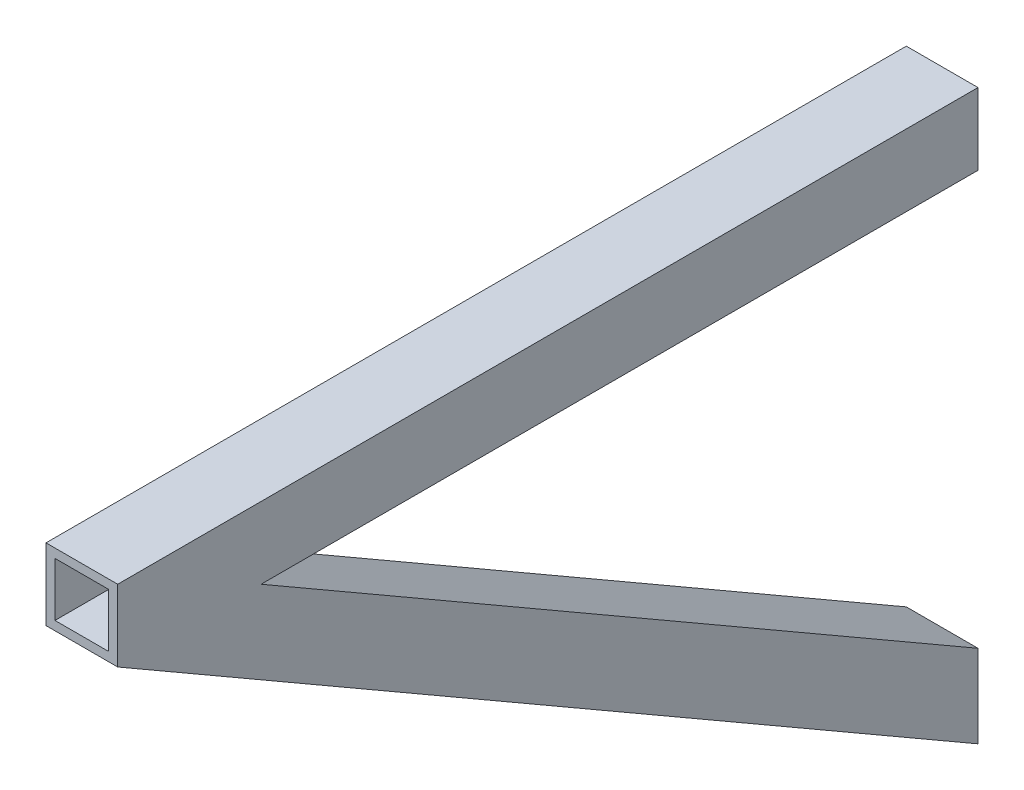
ISO-10303-21;
HEADER;
FILE_DESCRIPTION(('STEP AP214'),'2;1');
FILE_NAME('part.step','',(''),(''),'','','');
FILE_SCHEMA(('AUTOMOTIVE_DESIGN { 1 0 10303 214 1 1 1 1 }'));
ENDSEC;
DATA;
#1=APPLICATION_CONTEXT('core data for automotive mechanical design processes');
#2=APPLICATION_PROTOCOL_DEFINITION('international standard','automotive_design',2000,#1);
#3=PRODUCT_CONTEXT('',#1,'mechanical');
#4=PRODUCT('Part','Part','',(#3));
#5=PRODUCT_RELATED_PRODUCT_CATEGORY('part','',(#4));
#6=PRODUCT_DEFINITION_FORMATION('','',#4);
#7=PRODUCT_DEFINITION_CONTEXT('part definition',#1,'design');
#8=PRODUCT_DEFINITION('design','',#6,#7);
#9=PRODUCT_DEFINITION_SHAPE('','',#8);
#10=(LENGTH_UNIT() NAMED_UNIT(*) SI_UNIT(.MILLI.,.METRE.));
#11=(NAMED_UNIT(*) PLANE_ANGLE_UNIT() SI_UNIT($,.RADIAN.));
#12=(NAMED_UNIT(*) SI_UNIT($,.STERADIAN.) SOLID_ANGLE_UNIT());
#13=UNCERTAINTY_MEASURE_WITH_UNIT(LENGTH_MEASURE(1.E-05),#10,'distance_accuracy_value','');
#14=(GEOMETRIC_REPRESENTATION_CONTEXT(3) GLOBAL_UNCERTAINTY_ASSIGNED_CONTEXT((#13)) GLOBAL_UNIT_ASSIGNED_CONTEXT((#10,
#11,#12)) REPRESENTATION_CONTEXT('',''));
#15=CARTESIAN_POINT('',(0.,0.,0.));
#16=DIRECTION('',(0.,0.,1.));
#17=DIRECTION('',(1.,0.,0.));
#18=AXIS2_PLACEMENT_3D('',#15,#16,#17);
#19=CARTESIAN_POINT('',(0.,0.,304.8));
#20=DIRECTION('',(0.,1.,0.));
#21=DIRECTION('',(0.,0.,1.));
#22=AXIS2_PLACEMENT_3D('',#19,#20,#21);
#23=PLANE('',#22);
#24=DIRECTION('',(1.,0.,0.));
#25=VECTOR('',#24,1.);
#26=CARTESIAN_POINT('',(25.4,0.,254.));
#27=LINE('',#26,#25);
#28=CARTESIAN_POINT('',(0.,0.,254.));
#29=VERTEX_POINT('',#28);
#30=CARTESIAN_POINT('',(25.4,0.,254.));
#31=VERTEX_POINT('',#30);
#32=EDGE_CURVE('E176',#29,#31,#27,.T.);
#33=ORIENTED_EDGE('',*,*,#32,.F.);
#34=DIRECTION('',(0.,0.,-1.));
#35=VECTOR('',#34,1.);
#36=CARTESIAN_POINT('',(0.,0.,304.8));
#37=LINE('',#36,#35);
#38=CARTESIAN_POINT('',(0.,0.,0.));
#39=VERTEX_POINT('',#38);
#40=EDGE_CURVE('E51',#29,#39,#37,.T.);
#41=ORIENTED_EDGE('',*,*,#40,.T.);
#42=DIRECTION('',(1.,0.,0.));
#43=VECTOR('',#42,1.);
#44=CARTESIAN_POINT('',(0.,0.,0.));
#45=LINE('',#44,#43);
#46=CARTESIAN_POINT('',(25.4,0.,0.));
#47=VERTEX_POINT('',#46);
#48=EDGE_CURVE('E264',#39,#47,#45,.T.);
#49=ORIENTED_EDGE('',*,*,#48,.T.);
#50=DIRECTION('',(0.,0.,-1.));
#51=VECTOR('',#50,1.);
#52=CARTESIAN_POINT('',(25.4,0.,304.8));
#53=LINE('',#52,#51);
#54=EDGE_CURVE('E279',#31,#47,#53,.T.);
#55=ORIENTED_EDGE('',*,*,#54,.F.);
#56=EDGE_LOOP('',(#33,#41,#49,#55));
#57=FACE_BOUND('',#56,.T.);
#58=ADVANCED_FACE('F41',(#57),#23,.F.);
#59=CARTESIAN_POINT('',(0.,0.,304.8));
#60=DIRECTION('',(0.,0.,-1.));
#61=DIRECTION('',(-1.,0.,0.));
#62=AXIS2_PLACEMENT_3D('',#59,#60,#61);
#63=PLANE('',#62);
#64=DIRECTION('',(0.,-1.,0.));
#65=VECTOR('',#64,1.);
#66=CARTESIAN_POINT('',(0.,0.,304.8));
#67=LINE('',#66,#65);
#68=CARTESIAN_POINT('',(0.,25.4,304.8));
#69=VERTEX_POINT('',#68);
#70=CARTESIAN_POINT('',(0.,0.,304.8));
#71=VERTEX_POINT('',#70);
#72=EDGE_CURVE('E248',#69,#71,#67,.T.);
#73=ORIENTED_EDGE('',*,*,#72,.T.);
#74=DIRECTION('',(1.,0.,0.));
#75=VECTOR('',#74,1.);
#76=CARTESIAN_POINT('',(0.,0.,304.8));
#77=LINE('',#76,#75);
#78=CARTESIAN_POINT('',(25.4,0.,304.8));
#79=VERTEX_POINT('',#78);
#80=EDGE_CURVE('E189',#71,#79,#77,.T.);
#81=ORIENTED_EDGE('',*,*,#80,.T.);
#82=DIRECTION('',(0.,1.,0.));
#83=VECTOR('',#82,1.);
#84=CARTESIAN_POINT('',(25.4,0.,304.8));
#85=LINE('',#84,#83);
#86=CARTESIAN_POINT('',(25.4,25.4,304.8));
#87=VERTEX_POINT('',#86);
#88=EDGE_CURVE('E254',#79,#87,#85,.T.);
#89=ORIENTED_EDGE('',*,*,#88,.T.);
#90=DIRECTION('',(-1.,0.,0.));
#91=VECTOR('',#90,1.);
#92=CARTESIAN_POINT('',(0.,25.4,304.8));
#93=LINE('',#92,#91);
#94=EDGE_CURVE('E257',#87,#69,#93,.T.);
#95=ORIENTED_EDGE('',*,*,#94,.T.);
#96=EDGE_LOOP('',(#73,#81,#89,#95));
#97=FACE_BOUND('',#96,.T.);
#98=DIRECTION('',(0.,-1.,0.));
#99=VECTOR('',#98,1.);
#100=CARTESIAN_POINT('',(3.175,22.225,304.8));
#101=LINE('',#100,#99);
#102=CARTESIAN_POINT('',(3.175,22.225,304.8));
#103=VERTEX_POINT('',#102);
#104=CARTESIAN_POINT('',(3.175,3.175,304.8));
#105=VERTEX_POINT('',#104);
#106=EDGE_CURVE('E204',#103,#105,#101,.T.);
#107=ORIENTED_EDGE('',*,*,#106,.F.);
#108=DIRECTION('',(-1.,0.,0.));
#109=VECTOR('',#108,1.);
#110=CARTESIAN_POINT('',(3.175,22.225,304.8));
#111=LINE('',#110,#109);
#112=CARTESIAN_POINT('',(22.225,22.225,304.8));
#113=VERTEX_POINT('',#112);
#114=EDGE_CURVE('E215',#113,#103,#111,.T.);
#115=ORIENTED_EDGE('',*,*,#114,.F.);
#116=DIRECTION('',(0.,1.,0.));
#117=VECTOR('',#116,1.);
#118=CARTESIAN_POINT('',(22.225,22.225,304.8));
#119=LINE('',#118,#117);
#120=CARTESIAN_POINT('',(22.225,3.175,304.8));
#121=VERTEX_POINT('',#120);
#122=EDGE_CURVE('E211',#121,#113,#119,.T.);
#123=ORIENTED_EDGE('',*,*,#122,.F.);
#124=DIRECTION('',(1.,0.,0.));
#125=VECTOR('',#124,1.);
#126=CARTESIAN_POINT('',(3.175,3.175,304.8));
#127=LINE('',#126,#125);
#128=EDGE_CURVE('E207',#105,#121,#127,.T.);
#129=ORIENTED_EDGE('',*,*,#128,.F.);
#130=EDGE_LOOP('',(#107,#115,#123,#129));
#131=FACE_BOUND('',#130,.T.);
#132=ADVANCED_FACE('F371',(#97,#131),#63,.F.);
#133=CARTESIAN_POINT('',(0.,0.,0.));
#134=DIRECTION('',(0.,0.,-1.));
#135=DIRECTION('',(-1.,0.,0.));
#136=AXIS2_PLACEMENT_3D('',#133,#134,#135);
#137=PLANE('',#136);
#138=DIRECTION('',(0.,-1.,0.));
#139=VECTOR('',#138,1.);
#140=CARTESIAN_POINT('',(0.,0.,0.));
#141=LINE('',#140,#139);
#142=CARTESIAN_POINT('',(0.,25.4,0.));
#143=VERTEX_POINT('',#142);
#144=EDGE_CURVE('E247',#143,#39,#141,.T.);
#145=ORIENTED_EDGE('',*,*,#144,.F.);
#146=DIRECTION('',(-1.,0.,0.));
#147=VECTOR('',#146,1.);
#148=CARTESIAN_POINT('',(0.,25.4,0.));
#149=LINE('',#148,#147);
#150=CARTESIAN_POINT('',(25.4,25.4,0.));
#151=VERTEX_POINT('',#150);
#152=EDGE_CURVE('E251',#151,#143,#149,.T.);
#153=ORIENTED_EDGE('',*,*,#152,.F.);
#154=DIRECTION('',(0.,1.,0.));
#155=VECTOR('',#154,1.);
#156=CARTESIAN_POINT('',(25.4,0.,0.));
#157=LINE('',#156,#155);
#158=EDGE_CURVE('E268',#47,#151,#157,.T.);
#159=ORIENTED_EDGE('',*,*,#158,.F.);
#160=ORIENTED_EDGE('',*,*,#48,.F.);
#161=EDGE_LOOP('',(#145,#153,#159,#160));
#162=FACE_BOUND('',#161,.T.);
#163=DIRECTION('',(-1.,0.,0.));
#164=VECTOR('',#163,1.);
#165=CARTESIAN_POINT('',(3.175,22.225,0.));
#166=LINE('',#165,#164);
#167=CARTESIAN_POINT('',(22.225,22.225,0.));
#168=VERTEX_POINT('',#167);
#169=CARTESIAN_POINT('',(3.175,22.225,0.));
#170=VERTEX_POINT('',#169);
#171=EDGE_CURVE('E208',#168,#170,#166,.T.);
#172=ORIENTED_EDGE('',*,*,#171,.T.);
#173=DIRECTION('',(0.,-1.,0.));
#174=VECTOR('',#173,1.);
#175=CARTESIAN_POINT('',(3.175,22.225,0.));
#176=LINE('',#175,#174);
#177=CARTESIAN_POINT('',(3.175,3.175,0.));
#178=VERTEX_POINT('',#177);
#179=EDGE_CURVE('E219',#170,#178,#176,.T.);
#180=ORIENTED_EDGE('',*,*,#179,.T.);
#181=DIRECTION('',(1.,0.,0.));
#182=VECTOR('',#181,1.);
#183=CARTESIAN_POINT('',(3.175,3.175,0.));
#184=LINE('',#183,#182);
#185=CARTESIAN_POINT('',(22.225,3.175,0.));
#186=VERTEX_POINT('',#185);
#187=EDGE_CURVE('E223',#178,#186,#184,.T.);
#188=ORIENTED_EDGE('',*,*,#187,.T.);
#189=DIRECTION('',(0.,1.,0.));
#190=VECTOR('',#189,1.);
#191=CARTESIAN_POINT('',(22.225,22.225,0.));
#192=LINE('',#191,#190);
#193=EDGE_CURVE('E227',#186,#168,#192,.T.);
#194=ORIENTED_EDGE('',*,*,#193,.T.);
#195=EDGE_LOOP('',(#172,#180,#188,#194));
#196=FACE_BOUND('',#195,.T.);
#197=ADVANCED_FACE('F363',(#162,#196),#137,.T.);
#198=CARTESIAN_POINT('',(0.,0.,304.8));
#199=DIRECTION('',(1.,0.,0.));
#200=DIRECTION('',(0.,1.,0.));
#201=AXIS2_PLACEMENT_3D('',#198,#199,#200);
#202=PLANE('',#201);
#203=DIRECTION('',(0.,0.500000000000001,0.866025403784438));
#204=VECTOR('',#203,1.);
#205=CARTESIAN_POINT('',(0.,-190.5,-75.9556788418709));
#206=LINE('',#205,#204);
#207=CARTESIAN_POINT('',(0.,-146.646968374165,0.));
#208=VERTEX_POINT('',#207);
#209=EDGE_CURVE('E45',#208,#29,#206,.T.);
#210=ORIENTED_EDGE('',*,*,#209,.F.);
#211=DIRECTION('',(0.,1.,0.));
#212=VECTOR('',#211,1.);
#213=CARTESIAN_POINT('',(0.,-190.500025,0.));
#214=LINE('',#213,#212);
#215=CARTESIAN_POINT('',(0.,-175.976362048998,0.));
#216=VERTEX_POINT('',#215);
#217=EDGE_CURVE('E59',#216,#208,#214,.T.);
#218=ORIENTED_EDGE('',*,*,#217,.F.);
#219=DIRECTION('',(0.,0.500000000000001,0.866025403784438));
#220=VECTOR('',#219,1.);
#221=CARTESIAN_POINT('',(0.,-190.5,-25.1556788418709));
#222=LINE('',#221,#220);
#223=EDGE_CURVE('E181',#216,#71,#222,.T.);
#224=ORIENTED_EDGE('',*,*,#223,.T.);
#225=ORIENTED_EDGE('',*,*,#72,.F.);
#226=DIRECTION('',(0.,0.,-1.));
#227=VECTOR('',#226,1.);
#228=CARTESIAN_POINT('',(0.,25.4,304.8));
#229=LINE('',#228,#227);
#230=EDGE_CURVE('E260',#69,#143,#229,.T.);
#231=ORIENTED_EDGE('',*,*,#230,.T.);
#232=ORIENTED_EDGE('',*,*,#144,.T.);
#233=ORIENTED_EDGE('',*,*,#40,.F.);
#234=EDGE_LOOP('',(#210,#218,#224,#225,#231,#232,#233));
#235=FACE_BOUND('',#234,.T.);
#236=ADVANCED_FACE('F43',(#235),#202,.F.);
#237=CARTESIAN_POINT('',(25.4,0.,304.8));
#238=DIRECTION('',(-1.,0.,0.));
#239=DIRECTION('',(0.,-1.,0.));
#240=AXIS2_PLACEMENT_3D('',#237,#238,#239);
#241=PLANE('',#240);
#242=DIRECTION('',(0.,0.500000000000001,0.866025403784438));
#243=VECTOR('',#242,1.);
#244=CARTESIAN_POINT('',(25.4000000000001,-190.5,-25.1556788418709));
#245=LINE('',#244,#243);
#246=CARTESIAN_POINT('',(25.4,-175.976362048998,0.));
#247=VERTEX_POINT('',#246);
#248=EDGE_CURVE('E191',#247,#79,#245,.T.);
#249=ORIENTED_EDGE('',*,*,#248,.F.);
#250=DIRECTION('',(0.,1.,0.));
#251=VECTOR('',#250,1.);
#252=CARTESIAN_POINT('',(25.4,0.,0.));
#253=LINE('',#252,#251);
#254=CARTESIAN_POINT('',(25.4000000000001,-146.646968374165,0.));
#255=VERTEX_POINT('',#254);
#256=EDGE_CURVE('E172',#247,#255,#253,.T.);
#257=ORIENTED_EDGE('',*,*,#256,.T.);
#258=DIRECTION('',(0.,0.500000000000001,0.866025403784438));
#259=VECTOR('',#258,1.);
#260=CARTESIAN_POINT('',(25.4000000000001,-190.5,-75.9556788418709));
#261=LINE('',#260,#259);
#262=EDGE_CURVE('E199',#255,#31,#261,.T.);
#263=ORIENTED_EDGE('',*,*,#262,.T.);
#264=ORIENTED_EDGE('',*,*,#54,.T.);
#265=ORIENTED_EDGE('',*,*,#158,.T.);
#266=DIRECTION('',(0.,0.,-1.));
#267=VECTOR('',#266,1.);
#268=CARTESIAN_POINT('',(25.4,25.4,304.8));
#269=LINE('',#268,#267);
#270=EDGE_CURVE('E275',#87,#151,#269,.T.);
#271=ORIENTED_EDGE('',*,*,#270,.F.);
#272=ORIENTED_EDGE('',*,*,#88,.F.);
#273=EDGE_LOOP('',(#249,#257,#263,#264,#265,#271,#272));
#274=FACE_BOUND('',#273,.T.);
#275=ADVANCED_FACE('F350',(#274),#241,.F.);
#276=CARTESIAN_POINT('',(0.,25.4,304.8));
#277=DIRECTION('',(0.,-1.,0.));
#278=DIRECTION('',(0.,0.,-1.));
#279=AXIS2_PLACEMENT_3D('',#276,#277,#278);
#280=PLANE('',#279);
#281=ORIENTED_EDGE('',*,*,#152,.T.);
#282=ORIENTED_EDGE('',*,*,#230,.F.);
#283=ORIENTED_EDGE('',*,*,#94,.F.);
#284=ORIENTED_EDGE('',*,*,#270,.T.);
#285=EDGE_LOOP('',(#281,#282,#283,#284));
#286=FACE_BOUND('',#285,.T.);
#287=ADVANCED_FACE('F369',(#286),#280,.F.);
#288=CARTESIAN_POINT('',(3.175,22.225,304.8));
#289=DIRECTION('',(1.,0.,0.));
#290=DIRECTION('',(0.,1.,0.));
#291=AXIS2_PLACEMENT_3D('',#288,#289,#290);
#292=PLANE('',#291);
#293=ORIENTED_EDGE('',*,*,#179,.F.);
#294=DIRECTION('',(0.,0.,-1.));
#295=VECTOR('',#294,1.);
#296=CARTESIAN_POINT('',(3.175,22.225,304.8));
#297=LINE('',#296,#295);
#298=EDGE_CURVE('E218',#103,#170,#297,.T.);
#299=ORIENTED_EDGE('',*,*,#298,.F.);
#300=ORIENTED_EDGE('',*,*,#106,.T.);
#301=DIRECTION('',(0.,0.,-1.));
#302=VECTOR('',#301,1.);
#303=CARTESIAN_POINT('',(3.175,3.175,304.8));
#304=LINE('',#303,#302);
#305=EDGE_CURVE('E243',#105,#178,#304,.T.);
#306=ORIENTED_EDGE('',*,*,#305,.T.);
#307=EDGE_LOOP('',(#293,#299,#300,#306));
#308=FACE_BOUND('',#307,.T.);
#309=ADVANCED_FACE('F382',(#308),#292,.T.);
#310=CARTESIAN_POINT('',(3.175,3.175,304.8));
#311=DIRECTION('',(0.,1.,0.));
#312=DIRECTION('',(0.,0.,1.));
#313=AXIS2_PLACEMENT_3D('',#310,#311,#312);
#314=PLANE('',#313);
#315=ORIENTED_EDGE('',*,*,#187,.F.);
#316=ORIENTED_EDGE('',*,*,#305,.F.);
#317=ORIENTED_EDGE('',*,*,#128,.T.);
#318=DIRECTION('',(0.,0.,-1.));
#319=VECTOR('',#318,1.);
#320=CARTESIAN_POINT('',(22.225,3.175,304.8));
#321=LINE('',#320,#319);
#322=EDGE_CURVE('E240',#121,#186,#321,.T.);
#323=ORIENTED_EDGE('',*,*,#322,.T.);
#324=EDGE_LOOP('',(#315,#316,#317,#323));
#325=FACE_BOUND('',#324,.T.);
#326=ADVANCED_FACE('F384',(#325),#314,.T.);
#327=CARTESIAN_POINT('',(22.225,22.225,304.8));
#328=DIRECTION('',(-1.,0.,0.));
#329=DIRECTION('',(0.,0.,1.));
#330=AXIS2_PLACEMENT_3D('',#327,#328,#329);
#331=PLANE('',#330);
#332=ORIENTED_EDGE('',*,*,#193,.F.);
#333=ORIENTED_EDGE('',*,*,#322,.F.);
#334=ORIENTED_EDGE('',*,*,#122,.T.);
#335=DIRECTION('',(0.,0.,-1.));
#336=VECTOR('',#335,1.);
#337=CARTESIAN_POINT('',(22.225,22.225,304.8));
#338=LINE('',#337,#336);
#339=EDGE_CURVE('E237',#113,#168,#338,.T.);
#340=ORIENTED_EDGE('',*,*,#339,.T.);
#341=EDGE_LOOP('',(#332,#333,#334,#340));
#342=FACE_BOUND('',#341,.T.);
#343=ADVANCED_FACE('F391',(#342),#331,.T.);
#344=CARTESIAN_POINT('',(3.175,22.225,304.8));
#345=DIRECTION('',(0.,-1.,0.));
#346=DIRECTION('',(0.,0.,-1.));
#347=AXIS2_PLACEMENT_3D('',#344,#345,#346);
#348=PLANE('',#347);
#349=ORIENTED_EDGE('',*,*,#171,.F.);
#350=ORIENTED_EDGE('',*,*,#339,.F.);
#351=ORIENTED_EDGE('',*,*,#114,.T.);
#352=ORIENTED_EDGE('',*,*,#298,.T.);
#353=EDGE_LOOP('',(#349,#350,#351,#352));
#354=FACE_BOUND('',#353,.T.);
#355=ADVANCED_FACE('F389',(#354),#348,.T.);
#356=CARTESIAN_POINT('',(25.4000000000001,-190.5,-25.1556788418709));
#357=DIRECTION('',(0.,0.866025403784438,-0.500000000000001));
#358=DIRECTION('',(0.,0.500000000000001,0.866025403784438));
#359=AXIS2_PLACEMENT_3D('',#356,#357,#358);
#360=PLANE('',#359);
#361=ORIENTED_EDGE('',*,*,#223,.F.);
#362=DIRECTION('',(1.,0.,0.));
#363=VECTOR('',#362,1.);
#364=CARTESIAN_POINT('',(25.4000000000001,-175.976362048998,0.));
#365=LINE('',#364,#363);
#366=EDGE_CURVE('E169',#216,#247,#365,.T.);
#367=ORIENTED_EDGE('',*,*,#366,.T.);
#368=ORIENTED_EDGE('',*,*,#248,.T.);
#369=ORIENTED_EDGE('',*,*,#80,.F.);
#370=EDGE_LOOP('',(#361,#367,#368,#369));
#371=FACE_BOUND('',#370,.T.);
#372=ADVANCED_FACE('F187',(#371),#360,.F.);
#373=CARTESIAN_POINT('',(25.4000000000001,-190.5,-75.9556788418709));
#374=DIRECTION('',(0.,-0.866025403784438,0.500000000000001));
#375=DIRECTION('',(0.,-0.500000000000001,-0.866025403784438));
#376=AXIS2_PLACEMENT_3D('',#373,#374,#375);
#377=PLANE('',#376);
#378=ORIENTED_EDGE('',*,*,#262,.F.);
#379=DIRECTION('',(-1.,0.,0.));
#380=VECTOR('',#379,1.);
#381=CARTESIAN_POINT('',(25.4000000000001,-146.646968374165,0.));
#382=LINE('',#381,#380);
#383=EDGE_CURVE('E343',#255,#208,#382,.T.);
#384=ORIENTED_EDGE('',*,*,#383,.T.);
#385=ORIENTED_EDGE('',*,*,#209,.T.);
#386=ORIENTED_EDGE('',*,*,#32,.T.);
#387=EDGE_LOOP('',(#378,#384,#385,#386));
#388=FACE_BOUND('',#387,.T.);
#389=ADVANCED_FACE('F354',(#388),#377,.F.);
#390=CARTESIAN_POINT('',(0.,-190.500025,0.));
#391=DIRECTION('',(0.,0.,1.));
#392=DIRECTION('',(1.,0.,0.));
#393=AXIS2_PLACEMENT_3D('',#390,#391,#392);
#394=PLANE('',#393);
#395=DIRECTION('',(0.,1.,0.));
#396=VECTOR('',#395,1.);
#397=CARTESIAN_POINT('',(22.225,-190.5,0.));
#398=LINE('',#397,#396);
#399=CARTESIAN_POINT('',(22.2250000000001,-172.310187839644,0.));
#400=VERTEX_POINT('',#399);
#401=CARTESIAN_POINT('',(22.2250000000001,-150.313142583519,0.));
#402=VERTEX_POINT('',#401);
#403=EDGE_CURVE('E342',#400,#402,#398,.T.);
#404=ORIENTED_EDGE('',*,*,#403,.T.);
#405=DIRECTION('',(-1.,0.,0.));
#406=VECTOR('',#405,1.);
#407=CARTESIAN_POINT('',(22.2250000000001,-150.313142583519,0.));
#408=LINE('',#407,#406);
#409=CARTESIAN_POINT('',(3.17500000000005,-150.31314258352,0.));
#410=VERTEX_POINT('',#409);
#411=EDGE_CURVE('E330',#402,#410,#408,.T.);
#412=ORIENTED_EDGE('',*,*,#411,.T.);
#413=DIRECTION('',(0.,-1.,0.));
#414=VECTOR('',#413,1.);
#415=CARTESIAN_POINT('',(3.17500000000005,-190.5,0.));
#416=LINE('',#415,#414);
#417=CARTESIAN_POINT('',(3.17500000000005,-172.310187839644,0.));
#418=VERTEX_POINT('',#417);
#419=EDGE_CURVE('E66',#410,#418,#416,.T.);
#420=ORIENTED_EDGE('',*,*,#419,.T.);
#421=DIRECTION('',(1.,0.,0.));
#422=VECTOR('',#421,1.);
#423=CARTESIAN_POINT('',(22.2250000000001,-172.310187839644,0.));
#424=LINE('',#423,#422);
#425=EDGE_CURVE('E11',#418,#400,#424,.T.);
#426=ORIENTED_EDGE('',*,*,#425,.T.);
#427=EDGE_LOOP('',(#404,#412,#420,#426));
#428=FACE_BOUND('',#427,.T.);
#429=ORIENTED_EDGE('',*,*,#217,.T.);
#430=ORIENTED_EDGE('',*,*,#383,.F.);
#431=ORIENTED_EDGE('',*,*,#256,.F.);
#432=ORIENTED_EDGE('',*,*,#366,.F.);
#433=EDGE_LOOP('',(#429,#430,#431,#432));
#434=FACE_BOUND('',#433,.T.);
#435=ADVANCED_FACE('F170',(#428,#434),#394,.F.);
#436=DIRECTION('',(1.,0.,0.));
#437=VECTOR('',#436,1.);
#438=CARTESIAN_POINT('',(22.225,0.,260.35));
#439=LINE('',#438,#437);
#440=CARTESIAN_POINT('',(3.175,0.,260.35));
#441=VERTEX_POINT('',#440);
#442=CARTESIAN_POINT('',(22.225,0.,260.35));
#443=VERTEX_POINT('',#442);
#444=EDGE_CURVE('E300',#441,#443,#439,.T.);
#445=ORIENTED_EDGE('',*,*,#444,.T.);
#446=DIRECTION('',(0.,0.,1.));
#447=VECTOR('',#446,1.);
#448=CARTESIAN_POINT('',(22.225,0.,298.45));
#449=LINE('',#448,#447);
#450=CARTESIAN_POINT('',(22.225,0.,298.45));
#451=VERTEX_POINT('',#450);
#452=EDGE_CURVE('E292',#443,#451,#449,.T.);
#453=ORIENTED_EDGE('',*,*,#452,.T.);
#454=DIRECTION('',(-1.,0.,0.));
#455=VECTOR('',#454,1.);
#456=CARTESIAN_POINT('',(22.225,0.,298.45));
#457=LINE('',#456,#455);
#458=CARTESIAN_POINT('',(3.175,0.,298.45));
#459=VERTEX_POINT('',#458);
#460=EDGE_CURVE('E308',#451,#459,#457,.T.);
#461=ORIENTED_EDGE('',*,*,#460,.T.);
#462=DIRECTION('',(0.,0.,-1.));
#463=VECTOR('',#462,1.);
#464=CARTESIAN_POINT('',(3.175,0.,298.45));
#465=LINE('',#464,#463);
#466=EDGE_CURVE('E304',#459,#441,#465,.T.);
#467=ORIENTED_EDGE('',*,*,#466,.T.);
#468=EDGE_LOOP('',(#445,#453,#461,#467));
#469=FACE_BOUND('',#468,.T.);
#470=ADVANCED_FACE('F337',(#469),#23,.F.);
#471=CARTESIAN_POINT('',(22.2250000000001,-190.5,-31.5056788418709));
#472=DIRECTION('',(0.,0.866025403784438,-0.500000000000001));
#473=DIRECTION('',(0.,0.500000000000001,0.866025403784438));
#474=AXIS2_PLACEMENT_3D('',#471,#472,#473);
#475=PLANE('',#474);
#476=ORIENTED_EDGE('',*,*,#425,.F.);
#477=DIRECTION('',(0.,0.500000000000001,0.866025403784438));
#478=VECTOR('',#477,1.);
#479=CARTESIAN_POINT('',(3.17500000000005,-190.5,-31.5056788418709));
#480=LINE('',#479,#478);
#481=EDGE_CURVE('E314',#418,#459,#480,.T.);
#482=ORIENTED_EDGE('',*,*,#481,.T.);
#483=ORIENTED_EDGE('',*,*,#460,.F.);
#484=DIRECTION('',(0.,0.500000000000001,0.866025403784438));
#485=VECTOR('',#484,1.);
#486=CARTESIAN_POINT('',(22.2250000000001,-190.5,-31.5056788418709));
#487=LINE('',#486,#485);
#488=EDGE_CURVE('E196',#400,#451,#487,.T.);
#489=ORIENTED_EDGE('',*,*,#488,.F.);
#490=EDGE_LOOP('',(#476,#482,#483,#489));
#491=FACE_BOUND('',#490,.T.);
#492=ADVANCED_FACE('F341',(#491),#475,.T.);
#493=CARTESIAN_POINT('',(3.17500000000005,-190.5,-31.5056788418709));
#494=DIRECTION('',(1.,0.,0.));
#495=DIRECTION('',(0.,1.,0.));
#496=AXIS2_PLACEMENT_3D('',#493,#494,#495);
#497=PLANE('',#496);
#498=ORIENTED_EDGE('',*,*,#419,.F.);
#499=DIRECTION('',(0.,0.500000000000001,0.866025403784438));
#500=VECTOR('',#499,1.);
#501=CARTESIAN_POINT('',(3.17500000000006,-190.5,-69.6056788418709));
#502=LINE('',#501,#500);
#503=EDGE_CURVE('E315',#410,#441,#502,.T.);
#504=ORIENTED_EDGE('',*,*,#503,.T.);
#505=ORIENTED_EDGE('',*,*,#466,.F.);
#506=ORIENTED_EDGE('',*,*,#481,.F.);
#507=EDGE_LOOP('',(#498,#504,#505,#506));
#508=FACE_BOUND('',#507,.T.);
#509=ADVANCED_FACE('F339',(#508),#497,.T.);
#510=CARTESIAN_POINT('',(22.2250000000001,-190.5,-69.6056788418709));
#511=DIRECTION('',(0.,-0.866025403784438,0.500000000000001));
#512=DIRECTION('',(0.,-0.500000000000001,-0.866025403784438));
#513=AXIS2_PLACEMENT_3D('',#510,#511,#512);
#514=PLANE('',#513);
#515=ORIENTED_EDGE('',*,*,#411,.F.);
#516=DIRECTION('',(0.,0.500000000000001,0.866025403784438));
#517=VECTOR('',#516,1.);
#518=CARTESIAN_POINT('',(22.2250000000001,-190.5,-69.6056788418709));
#519=LINE('',#518,#517);
#520=EDGE_CURVE('E201',#402,#443,#519,.T.);
#521=ORIENTED_EDGE('',*,*,#520,.T.);
#522=ORIENTED_EDGE('',*,*,#444,.F.);
#523=ORIENTED_EDGE('',*,*,#503,.F.);
#524=EDGE_LOOP('',(#515,#521,#522,#523));
#525=FACE_BOUND('',#524,.T.);
#526=ADVANCED_FACE('F329',(#525),#514,.T.);
#527=CARTESIAN_POINT('',(22.2250000000001,-190.5,-31.5056788418709));
#528=DIRECTION('',(-1.,0.,0.));
#529=DIRECTION('',(0.,-1.,0.));
#530=AXIS2_PLACEMENT_3D('',#527,#528,#529);
#531=PLANE('',#530);
#532=ORIENTED_EDGE('',*,*,#403,.F.);
#533=ORIENTED_EDGE('',*,*,#488,.T.);
#534=ORIENTED_EDGE('',*,*,#452,.F.);
#535=ORIENTED_EDGE('',*,*,#520,.F.);
#536=EDGE_LOOP('',(#532,#533,#534,#535));
#537=FACE_BOUND('',#536,.T.);
#538=ADVANCED_FACE('F333',(#537),#531,.T.);
#539=CLOSED_SHELL('',(#58,#132,#197,#236,#275,#287,#309,#326,#343,#355,#372,#389,#435,#470,#492,
#509,#526,#538));
#540=MANIFOLD_SOLID_BREP('B2',#539);
#541=ADVANCED_BREP_SHAPE_REPRESENTATION('',(#18,#540),#14);
#542=SHAPE_DEFINITION_REPRESENTATION(#9,#541);
ENDSEC;
END-ISO-10303-21;
